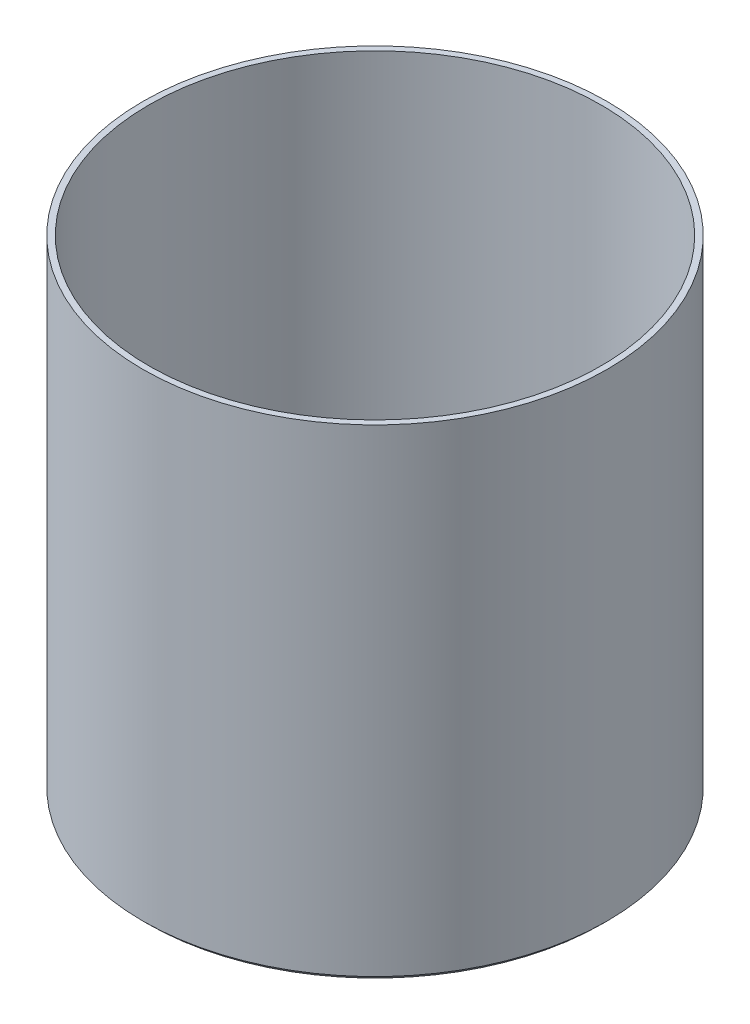
ISO-10303-21;
HEADER;
FILE_DESCRIPTION(('STEP AP214'),'2;1');
FILE_NAME('part.step','',(''),(''),'','','');
FILE_SCHEMA(('AUTOMOTIVE_DESIGN { 1 0 10303 214 1 1 1 1 }'));
ENDSEC;
DATA;
#1=APPLICATION_CONTEXT('core data for automotive mechanical design processes');
#2=APPLICATION_PROTOCOL_DEFINITION('international standard','automotive_design',2000,#1);
#3=PRODUCT_CONTEXT('',#1,'mechanical');
#4=PRODUCT('Part','Part','',(#3));
#5=PRODUCT_RELATED_PRODUCT_CATEGORY('part','',(#4));
#6=PRODUCT_DEFINITION_FORMATION('','',#4);
#7=PRODUCT_DEFINITION_CONTEXT('part definition',#1,'design');
#8=PRODUCT_DEFINITION('design','',#6,#7);
#9=PRODUCT_DEFINITION_SHAPE('','',#8);
#10=(LENGTH_UNIT() NAMED_UNIT(*) SI_UNIT(.MILLI.,.METRE.));
#11=(NAMED_UNIT(*) PLANE_ANGLE_UNIT() SI_UNIT($,.RADIAN.));
#12=(NAMED_UNIT(*) SI_UNIT($,.STERADIAN.) SOLID_ANGLE_UNIT());
#13=UNCERTAINTY_MEASURE_WITH_UNIT(LENGTH_MEASURE(1.E-05),#10,'distance_accuracy_value','');
#14=(GEOMETRIC_REPRESENTATION_CONTEXT(3) GLOBAL_UNCERTAINTY_ASSIGNED_CONTEXT((#13)) GLOBAL_UNIT_ASSIGNED_CONTEXT((#10,
#11,#12)) REPRESENTATION_CONTEXT('',''));
#15=CARTESIAN_POINT('',(0.,0.,0.));
#16=DIRECTION('',(0.,0.,1.));
#17=DIRECTION('',(1.,0.,0.));
#18=AXIS2_PLACEMENT_3D('',#15,#16,#17);
#19=CARTESIAN_POINT('',(0.,0.,0.));
#20=DIRECTION('',(0.,1.,0.));
#21=DIRECTION('',(1.,0.,0.));
#22=AXIS2_PLACEMENT_3D('',#19,#20,#21);
#23=PLANE('',#22);
#24=CARTESIAN_POINT('',(0.,0.,0.));
#25=DIRECTION('',(0.,-1.,0.));
#26=DIRECTION('',(1.,0.,0.));
#27=AXIS2_PLACEMENT_3D('',#24,#25,#26);
#28=CIRCLE('',#27,75.);
#29=CARTESIAN_POINT('',(-75.,0.,0.));
#30=VERTEX_POINT('',#29);
#31=EDGE_CURVE('E112',#30,#30,#28,.T.);
#32=ORIENTED_EDGE('',*,*,#31,.F.);
#33=EDGE_LOOP('',(#32));
#34=FACE_BOUND('',#33,.T.);
#35=CARTESIAN_POINT('',(0.,0.,-3.859385960316E-13));
#36=DIRECTION('',(0.,1.,0.));
#37=DIRECTION('',(1.,0.,0.));
#38=AXIS2_PLACEMENT_3D('',#35,#36,#37);
#39=CIRCLE('',#38,75.5);
#40=CARTESIAN_POINT('',(0.,0.,75.5));
#41=VERTEX_POINT('',#40);
#42=EDGE_CURVE('E11',#41,#41,#39,.T.);
#43=ORIENTED_EDGE('',*,*,#42,.F.);
#44=EDGE_LOOP('',(#43));
#45=FACE_BOUND('',#44,.T.);
#46=ADVANCED_FACE('F17',(#34,#45),#23,.F.);
#47=CARTESIAN_POINT('',(0.,0.74999999973,-3.859385960316E-13));
#48=DIRECTION('',(0.,1.,0.));
#49=DIRECTION('',(0.,0.,-1.));
#50=AXIS2_PLACEMENT_3D('',#47,#48,#49);
#51=CONICAL_SURFACE('',#50,76.24999999973,0.785398163397448);
#52=CARTESIAN_POINT('',(0.,1.5,0.));
#53=DIRECTION('',(0.,1.,0.));
#54=DIRECTION('',(1.,0.,0.));
#55=AXIS2_PLACEMENT_3D('',#52,#53,#54);
#56=CIRCLE('',#55,77.);
#57=CARTESIAN_POINT('',(0.,1.5000000000002,77.));
#58=VERTEX_POINT('',#57);
#59=CARTESIAN_POINT('',(-77.,1.5,0.));
#60=VERTEX_POINT('',#59);
#61=EDGE_CURVE('E68',#58,#60,#56,.T.);
#62=ORIENTED_EDGE('',*,*,#61,.F.);
#63=DIRECTION('',(0.,-0.707106781186548,-0.707106781186548));
#64=VECTOR('',#63,1.);
#65=CARTESIAN_POINT('',(0.,0.74999999973,76.2499999997296));
#66=LINE('',#65,#64);
#67=EDGE_CURVE('E27',#58,#41,#66,.T.);
#68=ORIENTED_EDGE('',*,*,#67,.T.);
#69=ORIENTED_EDGE('',*,*,#42,.T.);
#70=ORIENTED_EDGE('',*,*,#67,.F.);
#71=CARTESIAN_POINT('',(0.,1.5,0.));
#72=DIRECTION('',(0.,1.,0.));
#73=DIRECTION('',(1.,0.,0.));
#74=AXIS2_PLACEMENT_3D('',#71,#72,#73);
#75=CIRCLE('',#74,77.);
#76=EDGE_CURVE('E21',#60,#58,#75,.T.);
#77=ORIENTED_EDGE('',*,*,#76,.F.);
#78=EDGE_LOOP('',(#62,#68,#69,#70,#77));
#79=FACE_BOUND('',#78,.T.);
#80=ADVANCED_FACE('F91',(#79),#51,.T.);
#81=CARTESIAN_POINT('',(0.,-8.,0.));
#82=DIRECTION('',(0.,1.,0.));
#83=DIRECTION('',(1.,0.,0.));
#84=AXIS2_PLACEMENT_3D('',#81,#82,#83);
#85=CYLINDRICAL_SURFACE('',#84,77.);
#86=CARTESIAN_POINT('',(0.,160.,0.));
#87=DIRECTION('',(0.,1.,0.));
#88=DIRECTION('',(1.,0.,0.));
#89=AXIS2_PLACEMENT_3D('',#86,#87,#88);
#90=CIRCLE('',#89,77.);
#91=CARTESIAN_POINT('',(-77.,160.,0.));
#92=VERTEX_POINT('',#91);
#93=EDGE_CURVE('E66',#92,#92,#90,.T.);
#94=ORIENTED_EDGE('',*,*,#93,.F.);
#95=DIRECTION('',(0.,-1.,0.));
#96=VECTOR('',#95,1.);
#97=CARTESIAN_POINT('',(-77.,-8.,0.));
#98=LINE('',#97,#96);
#99=EDGE_CURVE('E63',#92,#60,#98,.T.);
#100=ORIENTED_EDGE('',*,*,#99,.T.);
#101=ORIENTED_EDGE('',*,*,#76,.T.);
#102=ORIENTED_EDGE('',*,*,#61,.T.);
#103=ORIENTED_EDGE('',*,*,#99,.F.);
#104=EDGE_LOOP('',(#94,#100,#101,#102,#103));
#105=FACE_BOUND('',#104,.T.);
#106=ADVANCED_FACE('F65',(#105),#85,.T.);
#107=CARTESIAN_POINT('',(0.,160.,0.));
#108=DIRECTION('',(0.,1.,0.));
#109=DIRECTION('',(1.,0.,0.));
#110=AXIS2_PLACEMENT_3D('',#107,#108,#109);
#111=PLANE('',#110);
#112=CARTESIAN_POINT('',(0.,160.,0.));
#113=DIRECTION('',(0.,1.,0.));
#114=DIRECTION('',(1.,0.,0.));
#115=AXIS2_PLACEMENT_3D('',#112,#113,#114);
#116=CIRCLE('',#115,75.);
#117=CARTESIAN_POINT('',(-75.,160.,0.));
#118=VERTEX_POINT('',#117);
#119=EDGE_CURVE('E73',#118,#118,#116,.T.);
#120=ORIENTED_EDGE('',*,*,#119,.F.);
#121=EDGE_LOOP('',(#120));
#122=FACE_BOUND('',#121,.T.);
#123=ORIENTED_EDGE('',*,*,#93,.T.);
#124=EDGE_LOOP('',(#123));
#125=FACE_BOUND('',#124,.T.);
#126=ADVANCED_FACE('F71',(#122,#125),#111,.T.);
#127=CARTESIAN_POINT('',(0.,-8.,0.));
#128=DIRECTION('',(0.,1.,0.));
#129=DIRECTION('',(1.,0.,0.));
#130=AXIS2_PLACEMENT_3D('',#127,#128,#129);
#131=CYLINDRICAL_SURFACE('',#130,75.);
#132=ORIENTED_EDGE('',*,*,#31,.T.);
#133=DIRECTION('',(0.,1.,0.));
#134=VECTOR('',#133,1.);
#135=CARTESIAN_POINT('',(-75.,-8.,0.));
#136=LINE('',#135,#134);
#137=EDGE_CURVE('E79',#30,#118,#136,.T.);
#138=ORIENTED_EDGE('',*,*,#137,.T.);
#139=ORIENTED_EDGE('',*,*,#119,.T.);
#140=ORIENTED_EDGE('',*,*,#137,.F.);
#141=EDGE_LOOP('',(#132,#138,#139,#140));
#142=FACE_BOUND('',#141,.T.);
#143=ADVANCED_FACE('F19',(#142),#131,.F.);
#144=CLOSED_SHELL('',(#46,#80,#106,#126,#143));
#145=MANIFOLD_SOLID_BREP('B1',#144);
#146=ADVANCED_BREP_SHAPE_REPRESENTATION('',(#18,#145),#14);
#147=SHAPE_DEFINITION_REPRESENTATION(#9,#146);
ENDSEC;
END-ISO-10303-21;
